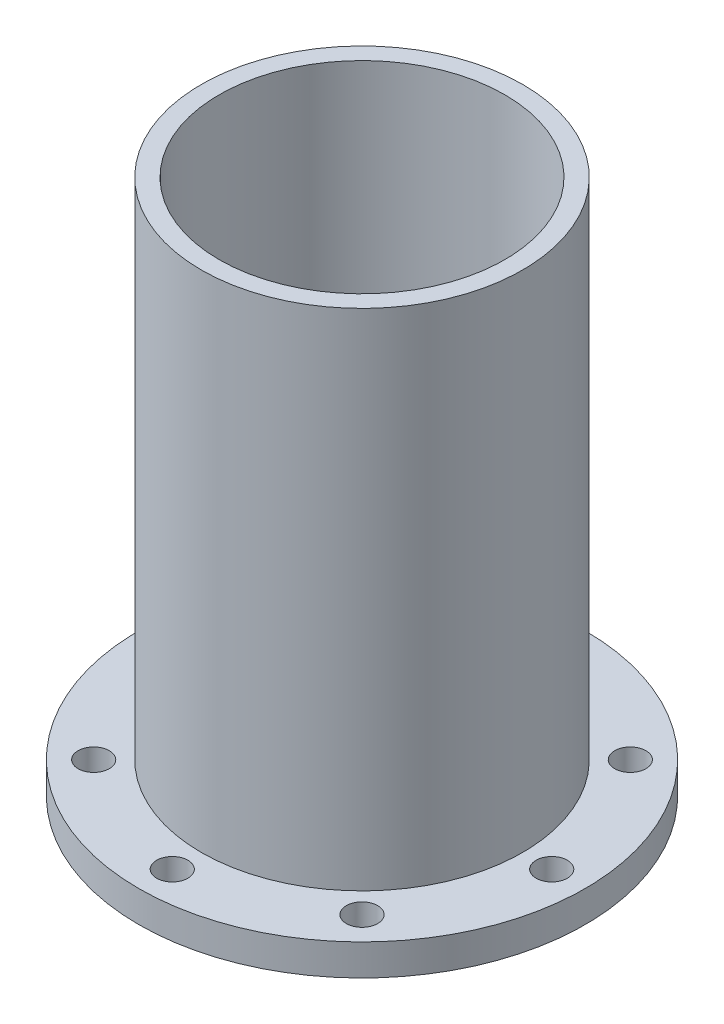
ISO-10303-21;
HEADER;
FILE_DESCRIPTION(('STEP AP214'),'2;1');
FILE_NAME('part.step','',(''),(''),'','','');
FILE_SCHEMA(('AUTOMOTIVE_DESIGN { 1 0 10303 214 1 1 1 1 }'));
ENDSEC;
DATA;
#1=APPLICATION_CONTEXT('core data for automotive mechanical design processes');
#2=APPLICATION_PROTOCOL_DEFINITION('international standard','automotive_design',2000,#1);
#3=PRODUCT_CONTEXT('',#1,'mechanical');
#4=PRODUCT('Part','Part','',(#3));
#5=PRODUCT_RELATED_PRODUCT_CATEGORY('part','',(#4));
#6=PRODUCT_DEFINITION_FORMATION('','',#4);
#7=PRODUCT_DEFINITION_CONTEXT('part definition',#1,'design');
#8=PRODUCT_DEFINITION('design','',#6,#7);
#9=PRODUCT_DEFINITION_SHAPE('','',#8);
#10=(LENGTH_UNIT() NAMED_UNIT(*) SI_UNIT(.MILLI.,.METRE.));
#11=(NAMED_UNIT(*) PLANE_ANGLE_UNIT() SI_UNIT($,.RADIAN.));
#12=(NAMED_UNIT(*) SI_UNIT($,.STERADIAN.) SOLID_ANGLE_UNIT());
#13=UNCERTAINTY_MEASURE_WITH_UNIT(LENGTH_MEASURE(1.E-05),#10,'distance_accuracy_value','');
#14=(GEOMETRIC_REPRESENTATION_CONTEXT(3) GLOBAL_UNCERTAINTY_ASSIGNED_CONTEXT((#13)) GLOBAL_UNIT_ASSIGNED_CONTEXT((#10,
#11,#12)) REPRESENTATION_CONTEXT('',''));
#15=CARTESIAN_POINT('',(0.,0.,0.));
#16=DIRECTION('',(0.,0.,1.));
#17=DIRECTION('',(1.,0.,0.));
#18=AXIS2_PLACEMENT_3D('',#15,#16,#17);
#19=CARTESIAN_POINT('',(-16.,30.,0.));
#20=DIRECTION('',(0.,1.,0.));
#21=DIRECTION('',(0.,0.,1.));
#22=AXIS2_PLACEMENT_3D('',#19,#20,#21);
#23=PLANE('',#22);
#24=CARTESIAN_POINT('',(0.,30.,0.));
#25=DIRECTION('',(0.,1.,0.));
#26=DIRECTION('',(0.,0.,1.));
#27=AXIS2_PLACEMENT_3D('',#24,#25,#26);
#28=CIRCLE('',#27,18.);
#29=CARTESIAN_POINT('',(0.,30.,18.));
#30=VERTEX_POINT('',#29);
#31=EDGE_CURVE('E10',#30,#30,#28,.T.);
#32=ORIENTED_EDGE('',*,*,#31,.T.);
#33=EDGE_LOOP('',(#32));
#34=FACE_BOUND('',#33,.T.);
#35=CARTESIAN_POINT('',(0.,30.,0.));
#36=DIRECTION('',(0.,1.,0.));
#37=DIRECTION('',(0.,0.,1.));
#38=AXIS2_PLACEMENT_3D('',#35,#36,#37);
#39=CIRCLE('',#38,16.);
#40=CARTESIAN_POINT('',(0.,30.,16.));
#41=VERTEX_POINT('',#40);
#42=EDGE_CURVE('E70',#41,#41,#39,.T.);
#43=ORIENTED_EDGE('',*,*,#42,.F.);
#44=EDGE_LOOP('',(#43));
#45=FACE_BOUND('',#44,.T.);
#46=ADVANCED_FACE('F31',(#34,#45),#23,.T.);
#47=CARTESIAN_POINT('',(0.,40.25,0.));
#48=DIRECTION('',(0.,1.,0.));
#49=DIRECTION('',(0.,0.,1.));
#50=AXIS2_PLACEMENT_3D('',#47,#48,#49);
#51=CYLINDRICAL_SURFACE('',#50,18.);
#52=CARTESIAN_POINT('',(0.,-26.5,0.));
#53=DIRECTION('',(0.,1.,0.));
#54=DIRECTION('',(0.,0.,1.));
#55=AXIS2_PLACEMENT_3D('',#52,#53,#54);
#56=CIRCLE('',#55,18.);
#57=CARTESIAN_POINT('',(0.,-26.5,18.));
#58=VERTEX_POINT('',#57);
#59=EDGE_CURVE('E38',#58,#58,#56,.T.);
#60=ORIENTED_EDGE('',*,*,#59,.T.);
#61=EDGE_LOOP('',(#60));
#62=FACE_BOUND('',#61,.T.);
#63=ORIENTED_EDGE('',*,*,#31,.F.);
#64=EDGE_LOOP('',(#63));
#65=FACE_BOUND('',#64,.T.);
#66=ADVANCED_FACE('F104',(#62,#65),#51,.T.);
#67=CARTESIAN_POINT('',(-25.,-26.5,0.));
#68=DIRECTION('',(0.,1.,0.));
#69=DIRECTION('',(0.,0.,1.));
#70=AXIS2_PLACEMENT_3D('',#67,#68,#69);
#71=PLANE('',#70);
#72=CARTESIAN_POINT('',(0.,-26.5,-21.25));
#73=DIRECTION('',(0.,1.,0.));
#74=DIRECTION('',(0.,0.,1.));
#75=AXIS2_PLACEMENT_3D('',#72,#73,#74);
#76=CIRCLE('',#75,1.75);
#77=CARTESIAN_POINT('',(0.,-26.5,-19.5));
#78=VERTEX_POINT('',#77);
#79=EDGE_CURVE('E51',#78,#78,#76,.T.);
#80=ORIENTED_EDGE('',*,*,#79,.F.);
#81=EDGE_LOOP('',(#80));
#82=FACE_BOUND('',#81,.T.);
#83=CARTESIAN_POINT('',(15.0260191002142,-26.5,-15.0260191002141));
#84=DIRECTION('',(0.,1.,0.));
#85=DIRECTION('',(0.,0.,1.));
#86=AXIS2_PLACEMENT_3D('',#83,#84,#85);
#87=CIRCLE('',#86,1.75000000000002);
#88=CARTESIAN_POINT('',(15.0260191002142,-26.5,-13.2760191002141));
#89=VERTEX_POINT('',#88);
#90=EDGE_CURVE('E224',#89,#89,#87,.T.);
#91=ORIENTED_EDGE('',*,*,#90,.F.);
#92=EDGE_LOOP('',(#91));
#93=FACE_BOUND('',#92,.T.);
#94=CARTESIAN_POINT('',(21.25,-26.5,0.));
#95=DIRECTION('',(0.,1.,0.));
#96=DIRECTION('',(0.,0.,1.));
#97=AXIS2_PLACEMENT_3D('',#94,#95,#96);
#98=CIRCLE('',#97,1.75000000000006);
#99=CARTESIAN_POINT('',(21.25,-26.5,1.75000000000007));
#100=VERTEX_POINT('',#99);
#101=EDGE_CURVE('E227',#100,#100,#98,.T.);
#102=ORIENTED_EDGE('',*,*,#101,.F.);
#103=EDGE_LOOP('',(#102));
#104=FACE_BOUND('',#103,.T.);
#105=CARTESIAN_POINT('',(15.0260191002142,-26.5,15.0260191002142));
#106=DIRECTION('',(0.,1.,0.));
#107=DIRECTION('',(0.,0.,1.));
#108=AXIS2_PLACEMENT_3D('',#105,#106,#107);
#109=CIRCLE('',#108,1.7500000000001);
#110=CARTESIAN_POINT('',(15.0260191002142,-26.5,16.7760191002143));
#111=VERTEX_POINT('',#110);
#112=EDGE_CURVE('E232',#111,#111,#109,.T.);
#113=ORIENTED_EDGE('',*,*,#112,.F.);
#114=EDGE_LOOP('',(#113));
#115=FACE_BOUND('',#114,.T.);
#116=CARTESIAN_POINT('',(0.,-26.5,21.25));
#117=DIRECTION('',(0.,1.,0.));
#118=DIRECTION('',(0.,0.,1.));
#119=AXIS2_PLACEMENT_3D('',#116,#117,#118);
#120=CIRCLE('',#119,1.75000000000014);
#121=CARTESIAN_POINT('',(0.,-26.5,23.0000000000002));
#122=VERTEX_POINT('',#121);
#123=EDGE_CURVE('E235',#122,#122,#120,.T.);
#124=ORIENTED_EDGE('',*,*,#123,.F.);
#125=EDGE_LOOP('',(#124));
#126=FACE_BOUND('',#125,.T.);
#127=CARTESIAN_POINT('',(-15.0260191002141,-26.5,15.0260191002142));
#128=DIRECTION('',(0.,1.,0.));
#129=DIRECTION('',(0.,0.,1.));
#130=AXIS2_PLACEMENT_3D('',#127,#128,#129);
#131=CIRCLE('',#130,1.75000000000019);
#132=CARTESIAN_POINT('',(-15.0260191002141,-26.5,16.7760191002144));
#133=VERTEX_POINT('',#132);
#134=EDGE_CURVE('E238',#133,#133,#131,.T.);
#135=ORIENTED_EDGE('',*,*,#134,.F.);
#136=EDGE_LOOP('',(#135));
#137=FACE_BOUND('',#136,.T.);
#138=CARTESIAN_POINT('',(-21.25,-26.5,0.));
#139=DIRECTION('',(0.,1.,0.));
#140=DIRECTION('',(0.,0.,1.));
#141=AXIS2_PLACEMENT_3D('',#138,#139,#140);
#142=CIRCLE('',#141,1.75000000000023);
#143=CARTESIAN_POINT('',(-21.25,-26.5,1.75000000000025));
#144=VERTEX_POINT('',#143);
#145=EDGE_CURVE('E240',#144,#144,#142,.T.);
#146=ORIENTED_EDGE('',*,*,#145,.F.);
#147=EDGE_LOOP('',(#146));
#148=FACE_BOUND('',#147,.T.);
#149=CARTESIAN_POINT('',(-15.0260191002141,-26.5,-15.0260191002141));
#150=DIRECTION('',(0.,1.,0.));
#151=DIRECTION('',(0.,0.,1.));
#152=AXIS2_PLACEMENT_3D('',#149,#150,#151);
#153=CIRCLE('',#152,1.75000000000026);
#154=CARTESIAN_POINT('',(-15.0260191002141,-26.5,-13.2760191002139));
#155=VERTEX_POINT('',#154);
#156=EDGE_CURVE('E82',#155,#155,#153,.T.);
#157=ORIENTED_EDGE('',*,*,#156,.F.);
#158=EDGE_LOOP('',(#157));
#159=FACE_BOUND('',#158,.T.);
#160=CARTESIAN_POINT('',(0.,-26.5,0.));
#161=DIRECTION('',(0.,1.,0.));
#162=DIRECTION('',(0.,0.,1.));
#163=AXIS2_PLACEMENT_3D('',#160,#161,#162);
#164=CIRCLE('',#163,25.);
#165=CARTESIAN_POINT('',(0.,-26.5,25.));
#166=VERTEX_POINT('',#165);
#167=EDGE_CURVE('E43',#166,#166,#164,.T.);
#168=ORIENTED_EDGE('',*,*,#167,.T.);
#169=EDGE_LOOP('',(#168));
#170=FACE_BOUND('',#169,.T.);
#171=ORIENTED_EDGE('',*,*,#59,.F.);
#172=EDGE_LOOP('',(#171));
#173=FACE_BOUND('',#172,.T.);
#174=ADVANCED_FACE('F89',(#82,#93,#104,#115,#126,#137,#148,#159,#170,#173),#71,.T.);
#175=CARTESIAN_POINT('',(0.,40.25,0.));
#176=DIRECTION('',(0.,1.,0.));
#177=DIRECTION('',(0.,0.,1.));
#178=AXIS2_PLACEMENT_3D('',#175,#176,#177);
#179=CYLINDRICAL_SURFACE('',#178,25.);
#180=CARTESIAN_POINT('',(0.,-30.,0.));
#181=DIRECTION('',(0.,1.,0.));
#182=DIRECTION('',(0.,0.,1.));
#183=AXIS2_PLACEMENT_3D('',#180,#181,#182);
#184=CIRCLE('',#183,25.);
#185=CARTESIAN_POINT('',(0.,-30.,25.));
#186=VERTEX_POINT('',#185);
#187=EDGE_CURVE('E79',#186,#186,#184,.T.);
#188=ORIENTED_EDGE('',*,*,#187,.T.);
#189=EDGE_LOOP('',(#188));
#190=FACE_BOUND('',#189,.T.);
#191=ORIENTED_EDGE('',*,*,#167,.F.);
#192=EDGE_LOOP('',(#191));
#193=FACE_BOUND('',#192,.T.);
#194=ADVANCED_FACE('F92',(#190,#193),#179,.T.);
#195=CARTESIAN_POINT('',(-16.,-30.,0.));
#196=DIRECTION('',(0.,-1.,0.));
#197=DIRECTION('',(0.,0.,-1.));
#198=AXIS2_PLACEMENT_3D('',#195,#196,#197);
#199=PLANE('',#198);
#200=CARTESIAN_POINT('',(0.,-30.,-21.25));
#201=DIRECTION('',(0.,-1.,0.));
#202=DIRECTION('',(0.,0.,-1.));
#203=AXIS2_PLACEMENT_3D('',#200,#201,#202);
#204=CIRCLE('',#203,1.75);
#205=CARTESIAN_POINT('',(0.,-30.,-23.));
#206=VERTEX_POINT('',#205);
#207=EDGE_CURVE('E34',#206,#206,#204,.T.);
#208=ORIENTED_EDGE('',*,*,#207,.F.);
#209=EDGE_LOOP('',(#208));
#210=FACE_BOUND('',#209,.T.);
#211=CARTESIAN_POINT('',(15.0260191002142,-30.,-15.0260191002141));
#212=DIRECTION('',(0.,-1.,0.));
#213=DIRECTION('',(0.,0.,-1.));
#214=AXIS2_PLACEMENT_3D('',#211,#212,#213);
#215=CIRCLE('',#214,1.75000000000002);
#216=CARTESIAN_POINT('',(15.0260191002142,-30.,-16.7760191002141));
#217=VERTEX_POINT('',#216);
#218=EDGE_CURVE('E65',#217,#217,#215,.T.);
#219=ORIENTED_EDGE('',*,*,#218,.F.);
#220=EDGE_LOOP('',(#219));
#221=FACE_BOUND('',#220,.T.);
#222=CARTESIAN_POINT('',(21.25,-30.,0.));
#223=DIRECTION('',(0.,-1.,0.));
#224=DIRECTION('',(0.,0.,-1.));
#225=AXIS2_PLACEMENT_3D('',#222,#223,#224);
#226=CIRCLE('',#225,1.75000000000006);
#227=CARTESIAN_POINT('',(21.25,-30.,-1.75000000000005));
#228=VERTEX_POINT('',#227);
#229=EDGE_CURVE('E63',#228,#228,#226,.T.);
#230=ORIENTED_EDGE('',*,*,#229,.F.);
#231=EDGE_LOOP('',(#230));
#232=FACE_BOUND('',#231,.T.);
#233=CARTESIAN_POINT('',(15.0260191002142,-30.,15.0260191002142));
#234=DIRECTION('',(0.,-1.,0.));
#235=DIRECTION('',(0.,0.,-1.));
#236=AXIS2_PLACEMENT_3D('',#233,#234,#235);
#237=CIRCLE('',#236,1.7500000000001);
#238=CARTESIAN_POINT('',(15.0260191002142,-30.,13.2760191002141));
#239=VERTEX_POINT('',#238);
#240=EDGE_CURVE('E60',#239,#239,#237,.T.);
#241=ORIENTED_EDGE('',*,*,#240,.F.);
#242=EDGE_LOOP('',(#241));
#243=FACE_BOUND('',#242,.T.);
#244=CARTESIAN_POINT('',(0.,-30.,21.25));
#245=DIRECTION('',(0.,-1.,0.));
#246=DIRECTION('',(0.,0.,-1.));
#247=AXIS2_PLACEMENT_3D('',#244,#245,#246);
#248=CIRCLE('',#247,1.75000000000014);
#249=CARTESIAN_POINT('',(0.,-30.,19.4999999999999));
#250=VERTEX_POINT('',#249);
#251=EDGE_CURVE('E57',#250,#250,#248,.T.);
#252=ORIENTED_EDGE('',*,*,#251,.F.);
#253=EDGE_LOOP('',(#252));
#254=FACE_BOUND('',#253,.T.);
#255=CARTESIAN_POINT('',(-15.0260191002141,-30.,15.0260191002142));
#256=DIRECTION('',(0.,-1.,0.));
#257=DIRECTION('',(0.,0.,-1.));
#258=AXIS2_PLACEMENT_3D('',#255,#256,#257);
#259=CIRCLE('',#258,1.75000000000019);
#260=CARTESIAN_POINT('',(-15.0260191002141,-30.,13.276019100214));
#261=VERTEX_POINT('',#260);
#262=EDGE_CURVE('E54',#261,#261,#259,.T.);
#263=ORIENTED_EDGE('',*,*,#262,.F.);
#264=EDGE_LOOP('',(#263));
#265=FACE_BOUND('',#264,.T.);
#266=CARTESIAN_POINT('',(-21.25,-30.,0.));
#267=DIRECTION('',(0.,-1.,0.));
#268=DIRECTION('',(0.,0.,-1.));
#269=AXIS2_PLACEMENT_3D('',#266,#267,#268);
#270=CIRCLE('',#269,1.75000000000023);
#271=CARTESIAN_POINT('',(-21.25,-30.,-1.75000000000021));
#272=VERTEX_POINT('',#271);
#273=EDGE_CURVE('E50',#272,#272,#270,.T.);
#274=ORIENTED_EDGE('',*,*,#273,.F.);
#275=EDGE_LOOP('',(#274));
#276=FACE_BOUND('',#275,.T.);
#277=CARTESIAN_POINT('',(-15.0260191002141,-30.,-15.0260191002141));
#278=DIRECTION('',(0.,-1.,0.));
#279=DIRECTION('',(0.,0.,-1.));
#280=AXIS2_PLACEMENT_3D('',#277,#278,#279);
#281=CIRCLE('',#280,1.75000000000026);
#282=CARTESIAN_POINT('',(-15.0260191002141,-30.,-16.7760191002144));
#283=VERTEX_POINT('',#282);
#284=EDGE_CURVE('E47',#283,#283,#281,.T.);
#285=ORIENTED_EDGE('',*,*,#284,.F.);
#286=EDGE_LOOP('',(#285));
#287=FACE_BOUND('',#286,.T.);
#288=CARTESIAN_POINT('',(0.,-30.,0.));
#289=DIRECTION('',(0.,1.,0.));
#290=DIRECTION('',(0.,0.,1.));
#291=AXIS2_PLACEMENT_3D('',#288,#289,#290);
#292=CIRCLE('',#291,16.);
#293=CARTESIAN_POINT('',(0.,-30.,16.));
#294=VERTEX_POINT('',#293);
#295=EDGE_CURVE('E74',#294,#294,#292,.T.);
#296=ORIENTED_EDGE('',*,*,#295,.T.);
#297=EDGE_LOOP('',(#296));
#298=FACE_BOUND('',#297,.T.);
#299=ORIENTED_EDGE('',*,*,#187,.F.);
#300=EDGE_LOOP('',(#299));
#301=FACE_BOUND('',#300,.T.);
#302=ADVANCED_FACE('F94',(#210,#221,#232,#243,#254,#265,#276,#287,#298,#301),#199,.T.);
#303=CARTESIAN_POINT('',(0.,40.25,0.));
#304=DIRECTION('',(0.,1.,0.));
#305=DIRECTION('',(0.,0.,1.));
#306=AXIS2_PLACEMENT_3D('',#303,#304,#305);
#307=CYLINDRICAL_SURFACE('',#306,16.);
#308=ORIENTED_EDGE('',*,*,#42,.T.);
#309=EDGE_LOOP('',(#308));
#310=FACE_BOUND('',#309,.T.);
#311=ORIENTED_EDGE('',*,*,#295,.F.);
#312=EDGE_LOOP('',(#311));
#313=FACE_BOUND('',#312,.T.);
#314=ADVANCED_FACE('F101',(#310,#313),#307,.F.);
#315=CARTESIAN_POINT('',(-15.0260191002141,-36.5,-15.0260191002141));
#316=DIRECTION('',(0.,1.,0.));
#317=DIRECTION('',(0.,0.,1.));
#318=AXIS2_PLACEMENT_3D('',#315,#316,#317);
#319=CYLINDRICAL_SURFACE('',#318,1.75000000000026);
#320=ORIENTED_EDGE('',*,*,#284,.T.);
#321=EDGE_LOOP('',(#320));
#322=FACE_BOUND('',#321,.T.);
#323=ORIENTED_EDGE('',*,*,#156,.T.);
#324=EDGE_LOOP('',(#323));
#325=FACE_BOUND('',#324,.T.);
#326=ADVANCED_FACE('F137',(#322,#325),#319,.F.);
#327=CARTESIAN_POINT('',(-21.25,-36.5,0.));
#328=DIRECTION('',(0.,1.,0.));
#329=DIRECTION('',(0.,0.,1.));
#330=AXIS2_PLACEMENT_3D('',#327,#328,#329);
#331=CYLINDRICAL_SURFACE('',#330,1.75000000000023);
#332=ORIENTED_EDGE('',*,*,#273,.T.);
#333=EDGE_LOOP('',(#332));
#334=FACE_BOUND('',#333,.T.);
#335=ORIENTED_EDGE('',*,*,#145,.T.);
#336=EDGE_LOOP('',(#335));
#337=FACE_BOUND('',#336,.T.);
#338=ADVANCED_FACE('F142',(#334,#337),#331,.F.);
#339=CARTESIAN_POINT('',(-15.0260191002141,-36.5,15.0260191002142));
#340=DIRECTION('',(0.,1.,0.));
#341=DIRECTION('',(0.,0.,1.));
#342=AXIS2_PLACEMENT_3D('',#339,#340,#341);
#343=CYLINDRICAL_SURFACE('',#342,1.75000000000019);
#344=ORIENTED_EDGE('',*,*,#262,.T.);
#345=EDGE_LOOP('',(#344));
#346=FACE_BOUND('',#345,.T.);
#347=ORIENTED_EDGE('',*,*,#134,.T.);
#348=EDGE_LOOP('',(#347));
#349=FACE_BOUND('',#348,.T.);
#350=ADVANCED_FACE('F152',(#346,#349),#343,.F.);
#351=CARTESIAN_POINT('',(0.,-36.5,21.25));
#352=DIRECTION('',(0.,1.,0.));
#353=DIRECTION('',(0.,0.,1.));
#354=AXIS2_PLACEMENT_3D('',#351,#352,#353);
#355=CYLINDRICAL_SURFACE('',#354,1.75000000000014);
#356=ORIENTED_EDGE('',*,*,#251,.T.);
#357=EDGE_LOOP('',(#356));
#358=FACE_BOUND('',#357,.T.);
#359=ORIENTED_EDGE('',*,*,#123,.T.);
#360=EDGE_LOOP('',(#359));
#361=FACE_BOUND('',#360,.T.);
#362=ADVANCED_FACE('F162',(#358,#361),#355,.F.);
#363=CARTESIAN_POINT('',(15.0260191002142,-36.5,15.0260191002142));
#364=DIRECTION('',(0.,1.,0.));
#365=DIRECTION('',(0.,0.,1.));
#366=AXIS2_PLACEMENT_3D('',#363,#364,#365);
#367=CYLINDRICAL_SURFACE('',#366,1.7500000000001);
#368=ORIENTED_EDGE('',*,*,#240,.T.);
#369=EDGE_LOOP('',(#368));
#370=FACE_BOUND('',#369,.T.);
#371=ORIENTED_EDGE('',*,*,#112,.T.);
#372=EDGE_LOOP('',(#371));
#373=FACE_BOUND('',#372,.T.);
#374=ADVANCED_FACE('F172',(#370,#373),#367,.F.);
#375=CARTESIAN_POINT('',(21.25,-36.5,0.));
#376=DIRECTION('',(0.,1.,0.));
#377=DIRECTION('',(0.,0.,1.));
#378=AXIS2_PLACEMENT_3D('',#375,#376,#377);
#379=CYLINDRICAL_SURFACE('',#378,1.75000000000006);
#380=ORIENTED_EDGE('',*,*,#229,.T.);
#381=EDGE_LOOP('',(#380));
#382=FACE_BOUND('',#381,.T.);
#383=ORIENTED_EDGE('',*,*,#101,.T.);
#384=EDGE_LOOP('',(#383));
#385=FACE_BOUND('',#384,.T.);
#386=ADVANCED_FACE('F182',(#382,#385),#379,.F.);
#387=CARTESIAN_POINT('',(15.0260191002142,-36.5,-15.0260191002141));
#388=DIRECTION('',(0.,1.,0.));
#389=DIRECTION('',(0.,0.,1.));
#390=AXIS2_PLACEMENT_3D('',#387,#388,#389);
#391=CYLINDRICAL_SURFACE('',#390,1.75000000000002);
#392=ORIENTED_EDGE('',*,*,#218,.T.);
#393=EDGE_LOOP('',(#392));
#394=FACE_BOUND('',#393,.T.);
#395=ORIENTED_EDGE('',*,*,#90,.T.);
#396=EDGE_LOOP('',(#395));
#397=FACE_BOUND('',#396,.T.);
#398=ADVANCED_FACE('F192',(#394,#397),#391,.F.);
#399=CARTESIAN_POINT('',(0.,-36.5,-21.25));
#400=DIRECTION('',(0.,1.,0.));
#401=DIRECTION('',(0.,0.,1.));
#402=AXIS2_PLACEMENT_3D('',#399,#400,#401);
#403=CYLINDRICAL_SURFACE('',#402,1.75);
#404=ORIENTED_EDGE('',*,*,#207,.T.);
#405=EDGE_LOOP('',(#404));
#406=FACE_BOUND('',#405,.T.);
#407=ORIENTED_EDGE('',*,*,#79,.T.);
#408=EDGE_LOOP('',(#407));
#409=FACE_BOUND('',#408,.T.);
#410=ADVANCED_FACE('F202',(#406,#409),#403,.F.);
#411=CLOSED_SHELL('',(#46,#66,#174,#194,#302,#314,#326,#338,#350,#362,#374,#386,#398,#410));
#412=MANIFOLD_SOLID_BREP('B2',#411);
#413=ADVANCED_BREP_SHAPE_REPRESENTATION('',(#18,#412),#14);
#414=SHAPE_DEFINITION_REPRESENTATION(#9,#413);
ENDSEC;
END-ISO-10303-21;
